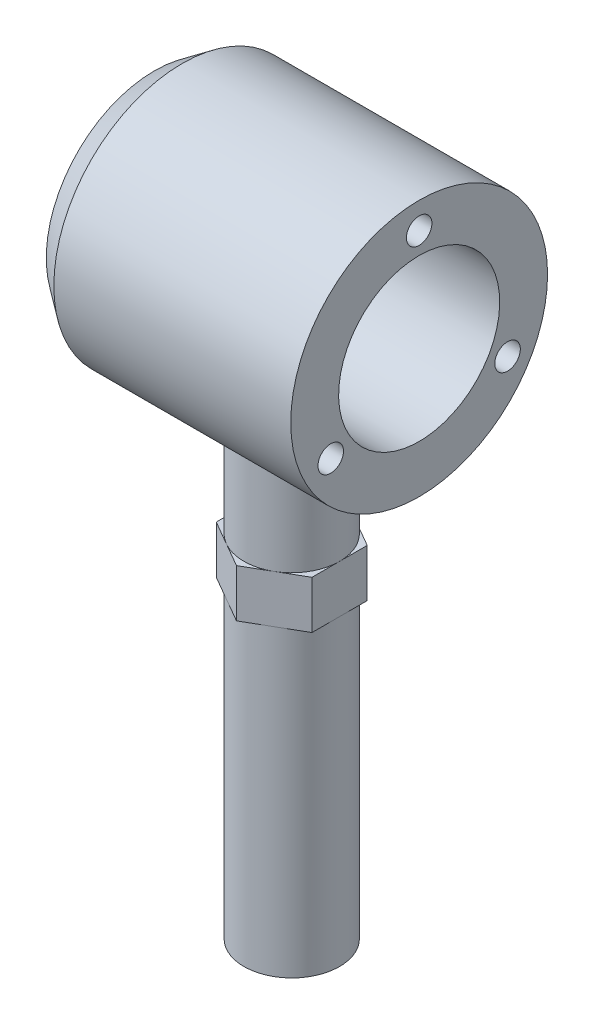
ISO-10303-21;
HEADER;
FILE_DESCRIPTION(('STEP AP214'),'2;1');
FILE_NAME('part.step','',(''),(''),'','','');
FILE_SCHEMA(('AUTOMOTIVE_DESIGN { 1 0 10303 214 1 1 1 1 }'));
ENDSEC;
DATA;
#1=APPLICATION_CONTEXT('core data for automotive mechanical design processes');
#2=APPLICATION_PROTOCOL_DEFINITION('international standard','automotive_design',2000,#1);
#3=PRODUCT_CONTEXT('',#1,'mechanical');
#4=PRODUCT('Part','Part','',(#3));
#5=PRODUCT_RELATED_PRODUCT_CATEGORY('part','',(#4));
#6=PRODUCT_DEFINITION_FORMATION('','',#4);
#7=PRODUCT_DEFINITION_CONTEXT('part definition',#1,'design');
#8=PRODUCT_DEFINITION('design','',#6,#7);
#9=PRODUCT_DEFINITION_SHAPE('','',#8);
#10=(LENGTH_UNIT() NAMED_UNIT(*) SI_UNIT(.MILLI.,.METRE.));
#11=(NAMED_UNIT(*) PLANE_ANGLE_UNIT() SI_UNIT($,.RADIAN.));
#12=(NAMED_UNIT(*) SI_UNIT($,.STERADIAN.) SOLID_ANGLE_UNIT());
#13=UNCERTAINTY_MEASURE_WITH_UNIT(LENGTH_MEASURE(1.E-05),#10,'distance_accuracy_value','');
#14=(GEOMETRIC_REPRESENTATION_CONTEXT(3) GLOBAL_UNCERTAINTY_ASSIGNED_CONTEXT((#13)) GLOBAL_UNIT_ASSIGNED_CONTEXT((#10,
#11,#12)) REPRESENTATION_CONTEXT('',''));
#15=CARTESIAN_POINT('',(0.,0.,0.));
#16=DIRECTION('',(0.,0.,1.));
#17=DIRECTION('',(1.,0.,0.));
#18=AXIS2_PLACEMENT_3D('',#15,#16,#17);
#19=CARTESIAN_POINT('',(0.,-85.2499999999994,0.));
#20=DIRECTION('',(0.,-1.,0.));
#21=DIRECTION('',(0.,0.,-1.));
#22=AXIS2_PLACEMENT_3D('',#19,#20,#21);
#23=PLANE('',#22);
#24=CARTESIAN_POINT('',(41.8971242584859,-85.2499999999994,0.));
#25=DIRECTION('',(0.,-1.,0.));
#26=DIRECTION('',(0.,0.,-1.));
#27=AXIS2_PLACEMENT_3D('',#24,#25,#26);
#28=CIRCLE('',#27,15.);
#29=CARTESIAN_POINT('',(49.3971242584859,-85.2499999999994,-12.9903810567666));
#30=VERTEX_POINT('',#29);
#31=CARTESIAN_POINT('',(56.8971242584859,-85.2499999999994,0.));
#32=VERTEX_POINT('',#31);
#33=EDGE_CURVE('E46',#30,#32,#28,.T.);
#34=ORIENTED_EDGE('',*,*,#33,.F.);
#35=DIRECTION('',(0.866025403784438,0.,0.5));
#36=VECTOR('',#35,1.);
#37=CARTESIAN_POINT('',(41.8971242584859,-85.2499999999994,-17.3205080756888));
#38=LINE('',#37,#36);
#39=CARTESIAN_POINT('',(56.8971242584859,-85.2499999999994,-8.66025403784439));
#40=VERTEX_POINT('',#39);
#41=EDGE_CURVE('E134',#30,#40,#38,.T.);
#42=ORIENTED_EDGE('',*,*,#41,.T.);
#43=DIRECTION('',(0.,0.,1.));
#44=VECTOR('',#43,1.);
#45=CARTESIAN_POINT('',(56.8971242584859,-85.2499999999994,-8.66025403784439));
#46=LINE('',#45,#44);
#47=EDGE_CURVE('E147',#40,#32,#46,.T.);
#48=ORIENTED_EDGE('',*,*,#47,.T.);
#49=EDGE_LOOP('',(#34,#42,#48));
#50=FACE_BOUND('',#49,.T.);
#51=ADVANCED_FACE('F35',(#50),#23,.T.);
#52=CARTESIAN_POINT('',(49.3971242584859,-85.2499999999994,12.9903810567666));
#53=VERTEX_POINT('',#52);
#54=EDGE_CURVE('E11',#32,#53,#28,.T.);
#55=ORIENTED_EDGE('',*,*,#54,.F.);
#56=CARTESIAN_POINT('',(56.8971242584859,-85.2499999999994,8.66025403784441));
#57=VERTEX_POINT('',#56);
#58=EDGE_CURVE('E133',#32,#57,#46,.T.);
#59=ORIENTED_EDGE('',*,*,#58,.T.);
#60=DIRECTION('',(-0.866025403784439,0.,0.5));
#61=VECTOR('',#60,1.);
#62=CARTESIAN_POINT('',(56.8971242584859,-85.2499999999994,8.66025403784441));
#63=LINE('',#62,#61);
#64=EDGE_CURVE('E161',#57,#53,#63,.T.);
#65=ORIENTED_EDGE('',*,*,#64,.T.);
#66=EDGE_LOOP('',(#55,#59,#65));
#67=FACE_BOUND('',#66,.T.);
#68=ADVANCED_FACE('F291',(#67),#23,.T.);
#69=CARTESIAN_POINT('',(34.3971242584859,-85.2499999999994,12.9903810567666));
#70=VERTEX_POINT('',#69);
#71=EDGE_CURVE('E44',#53,#70,#28,.T.);
#72=ORIENTED_EDGE('',*,*,#71,.F.);
#73=CARTESIAN_POINT('',(41.8971242584859,-85.2499999999994,17.3205080756888));
#74=VERTEX_POINT('',#73);
#75=EDGE_CURVE('E160',#53,#74,#63,.T.);
#76=ORIENTED_EDGE('',*,*,#75,.T.);
#77=DIRECTION('',(-0.866025403784438,0.,-0.5));
#78=VECTOR('',#77,1.);
#79=CARTESIAN_POINT('',(41.8971242584859,-85.2499999999994,17.3205080756888));
#80=LINE('',#79,#78);
#81=EDGE_CURVE('E165',#74,#70,#80,.T.);
#82=ORIENTED_EDGE('',*,*,#81,.T.);
#83=EDGE_LOOP('',(#72,#76,#82));
#84=FACE_BOUND('',#83,.T.);
#85=ADVANCED_FACE('F295',(#84),#23,.T.);
#86=CARTESIAN_POINT('',(26.8971242584859,-85.2499999999994,0.));
#87=VERTEX_POINT('',#86);
#88=EDGE_CURVE('E153',#70,#87,#28,.T.);
#89=ORIENTED_EDGE('',*,*,#88,.F.);
#90=CARTESIAN_POINT('',(26.8971242584859,-85.2499999999994,8.6602540378444));
#91=VERTEX_POINT('',#90);
#92=EDGE_CURVE('E164',#70,#91,#80,.T.);
#93=ORIENTED_EDGE('',*,*,#92,.T.);
#94=DIRECTION('',(0.,0.,-1.));
#95=VECTOR('',#94,1.);
#96=CARTESIAN_POINT('',(26.8971242584859,-85.2499999999994,8.6602540378444));
#97=LINE('',#96,#95);
#98=EDGE_CURVE('E169',#91,#87,#97,.T.);
#99=ORIENTED_EDGE('',*,*,#98,.T.);
#100=EDGE_LOOP('',(#89,#93,#99));
#101=FACE_BOUND('',#100,.T.);
#102=ADVANCED_FACE('F300',(#101),#23,.T.);
#103=CARTESIAN_POINT('',(34.3971242584859,-85.2499999999994,-12.9903810567666));
#104=VERTEX_POINT('',#103);
#105=EDGE_CURVE('E61',#87,#104,#28,.T.);
#106=ORIENTED_EDGE('',*,*,#105,.F.);
#107=CARTESIAN_POINT('',(26.8971242584859,-85.2499999999994,-8.66025403784439));
#108=VERTEX_POINT('',#107);
#109=EDGE_CURVE('E168',#87,#108,#97,.T.);
#110=ORIENTED_EDGE('',*,*,#109,.T.);
#111=DIRECTION('',(0.866025403784439,0.,-0.5));
#112=VECTOR('',#111,1.);
#113=CARTESIAN_POINT('',(26.8971242584859,-85.2499999999994,-8.66025403784439));
#114=LINE('',#113,#112);
#115=EDGE_CURVE('E172',#108,#104,#114,.T.);
#116=ORIENTED_EDGE('',*,*,#115,.T.);
#117=EDGE_LOOP('',(#106,#110,#116));
#118=FACE_BOUND('',#117,.T.);
#119=ADVANCED_FACE('F256',(#118),#23,.T.);
#120=CARTESIAN_POINT('',(28.8350884325895,2.56739074444567E-13,0.));
#121=DIRECTION('',(1.,0.,0.));
#122=DIRECTION('',(0.,1.,0.));
#123=AXIS2_PLACEMENT_3D('',#120,#121,#122);
#124=CYLINDRICAL_SURFACE('',#123,40.2499999999997);
#125=CARTESIAN_POINT('',(81.8350884325897,4.70445966746391E-13,0.));
#126=DIRECTION('',(1.,0.,0.));
#127=DIRECTION('',(0.,1.,0.));
#128=AXIS2_PLACEMENT_3D('',#125,#126,#127);
#129=CIRCLE('',#128,40.2499999999995);
#130=CARTESIAN_POINT('',(81.8350884325895,40.25,0.));
#131=VERTEX_POINT('',#130);
#132=EDGE_CURVE('E395',#131,#131,#129,.T.);
#133=ORIENTED_EDGE('',*,*,#132,.F.);
#134=EDGE_LOOP('',(#133));
#135=FACE_BOUND('',#134,.T.);
#136=CARTESIAN_POINT('',(7.57330234901002,1.71007183336871E-13,0.));
#137=DIRECTION('',(1.,0.,0.));
#138=DIRECTION('',(0.,1.,0.));
#139=AXIS2_PLACEMENT_3D('',#136,#137,#138);
#140=CIRCLE('',#139,40.2499999999998);
#141=CARTESIAN_POINT('',(7.57330234900986,40.25,0.));
#142=VERTEX_POINT('',#141);
#143=EDGE_CURVE('E392',#142,#142,#140,.T.);
#144=ORIENTED_EDGE('',*,*,#143,.T.);
#145=EDGE_LOOP('',(#144));
#146=FACE_BOUND('',#145,.T.);
#147=CARTESIAN_POINT('',(41.8971242584859,-37.3505354713952,-15.));
#148=CARTESIAN_POINT('',(41.4918986978602,-37.3505338025353,-15.0000018497057));
#149=CARTESIAN_POINT('',(41.0866982597162,-37.3571477327432,-14.9835659963186));
#150=CARTESIAN_POINT('',(40.2793995634444,-37.3833761869725,-14.9180072768781));
#151=CARTESIAN_POINT('',(39.8773010620853,-37.4029896809622,-14.8688870006024));
#152=CARTESIAN_POINT('',(39.0791892176302,-37.4545677515676,-14.7384785565835));
#153=CARTESIAN_POINT('',(38.6831756511136,-37.4865318735733,-14.6571915728509));
#154=CARTESIAN_POINT('',(37.9000054329187,-37.5617825214386,-14.4632566805358));
#155=CARTESIAN_POINT('',(37.5128490314259,-37.6050693666994,-14.3506078872666));
#156=CARTESIAN_POINT('',(36.75090780851,-37.7015058503863,-14.0953009450391));
#157=CARTESIAN_POINT('',(36.3760951469648,-37.7546312058185,-13.9527165684369));
#158=CARTESIAN_POINT('',(35.6401650063317,-37.8692473637011,-13.6385681081603));
#159=CARTESIAN_POINT('',(35.2790474217659,-37.9307381017055,-13.4670042477382));
#160=CARTESIAN_POINT('',(34.5725545360774,-38.0603626486624,-13.0961771681135));
#161=CARTESIAN_POINT('',(34.2271802917306,-38.1284969026018,-12.8969120930849));
#162=CARTESIAN_POINT('',(33.553957865317,-38.2696032267491,-12.4719723252303));
#163=CARTESIAN_POINT('',(33.226116085081,-38.3425770425873,-12.2462880803025));
#164=CARTESIAN_POINT('',(32.5756569642096,-38.4947770447326,-11.7593599683097));
#165=CARTESIAN_POINT('',(32.2539199789196,-38.5741369644634,-11.496981212973));
#166=CARTESIAN_POINT('',(31.6334232315975,-38.733914872845,-10.9466174539189));
#167=CARTESIAN_POINT('',(31.3346641867453,-38.8143328944293,-10.6586316515671));
#168=CARTESIAN_POINT('',(30.7617758903872,-38.974129560428,-10.0586343101454));
#169=CARTESIAN_POINT('',(30.4876559816715,-39.0535078009082,-9.74661374003535));
#170=CARTESIAN_POINT('',(29.9659751475847,-39.2090913128773,-9.10054997178441));
#171=CARTESIAN_POINT('',(29.7184050312948,-39.2852976767697,-8.76651445977742));
#172=CARTESIAN_POINT('',(29.2434769097455,-39.4350705412568,-8.06660072628778));
#173=CARTESIAN_POINT('',(29.017085594269,-39.5084606085146,-7.70002766482184));
#174=CARTESIAN_POINT('',(28.5961421686724,-39.6476879064449,-6.94763946263695));
#175=CARTESIAN_POINT('',(28.4015909783137,-39.7135249189169,-6.56182376647844));
#176=CARTESIAN_POINT('',(28.0460795265715,-39.8357386173575,-5.7736807254816));
#177=CARTESIAN_POINT('',(27.8851103697655,-39.8921178077969,-5.3713577870622));
#178=CARTESIAN_POINT('',(27.5982494534346,-39.9937784357444,-4.55303546250069));
#179=CARTESIAN_POINT('',(27.4723557781209,-40.0390604793517,-4.13703682470012));
#180=CARTESIAN_POINT('',(27.2615422056069,-40.1155024238907,-3.31255173926044));
#181=CARTESIAN_POINT('',(27.1751039413366,-40.1471822104725,-2.9045014585279));
#182=CARTESIAN_POINT('',(27.0364442876051,-40.1982355576367,-2.08186431923066));
#183=CARTESIAN_POINT('',(26.9842220101725,-40.2176094375809,-1.6672776305844));
#184=CARTESIAN_POINT('',(26.9145573389342,-40.2434934432216,-0.834906065271848));
#185=CARTESIAN_POINT('',(26.8971053965612,-40.250007100565,-0.417122098282105));
#186=CARTESIAN_POINT('',(26.8971431492582,-40.2499928886853,0.418438033509508));
#187=CARTESIAN_POINT('',(26.9146318028312,-40.2434654081876,0.836214198172751));
#188=CARTESIAN_POINT('',(26.9826471134102,-40.2181949424941,1.64806112527682));
#189=CARTESIAN_POINT('',(27.0315148721919,-40.2000654666236,2.04229133982967));
#190=CARTESIAN_POINT('',(27.1602036447057,-40.1526555974769,2.82496842263227));
#191=CARTESIAN_POINT('',(27.2400234611382,-40.123375635529,3.21341551398361));
#192=CARTESIAN_POINT('',(27.4298835629872,-40.0544097382854,3.98191162361454));
#193=CARTESIAN_POINT('',(27.5399249307856,-40.0147234302898,4.36196034058038));
#194=CARTESIAN_POINT('',(27.789270596936,-39.9259373230551,5.1111995503836));
#195=CARTESIAN_POINT('',(27.9285756513744,-39.8768372805961,5.48038976238858));
#196=CARTESIAN_POINT('',(28.2375372439613,-39.7696558863483,6.21089564805672));
#197=CARTESIAN_POINT('',(28.4076032171408,-39.711455023129,6.57202048671505));
#198=CARTESIAN_POINT('',(28.7753834756469,-39.5880358697858,7.27863813029077));
#199=CARTESIAN_POINT('',(28.9730978552793,-39.5228175557263,7.6241308818835));
#200=CARTESIAN_POINT('',(29.3948121202575,-39.3869327395012,8.29759353426153));
#201=CARTESIAN_POINT('',(29.6188145981394,-39.3162657002176,8.62556170212029));
#202=CARTESIAN_POINT('',(30.0917353315306,-39.1711507284454,9.26229625753831));
#203=CARTESIAN_POINT('',(30.3406624931331,-39.0967014492006,9.57105571708524));
#204=CARTESIAN_POINT('',(30.8769579461978,-38.941455430761,10.1848645665764));
#205=CARTESIAN_POINT('',(31.1657157019442,-38.8605403437778,10.4886712801395));
#206=CARTESIAN_POINT('',(31.7676272725638,-38.698645959678,11.0710740789718));
#207=CARTESIAN_POINT('',(32.0807822630617,-38.6176666596535,11.3496689479629));
#208=CARTESIAN_POINT('',(32.7297765397675,-38.457818906184,11.8800431653279));
#209=CARTESIAN_POINT('',(33.0656254432914,-38.3789513676898,12.1318110268962));
#210=CARTESIAN_POINT('',(33.757801015647,-38.2256098627158,12.6066448404323));
#211=CARTESIAN_POINT('',(34.1141200359749,-38.1511342760251,12.8297214130699));
#212=CARTESIAN_POINT('',(34.8532732216621,-38.0071586193817,13.2502411581944));
#213=CARTESIAN_POINT('',(35.2365178500808,-37.9378037439507,13.4470137715939));
#214=CARTESIAN_POINT('',(36.0198133101411,-37.8081490961145,13.8073552057818));
#215=CARTESIAN_POINT('',(36.419864504562,-37.7478495193016,13.9709233093873));
#216=CARTESIAN_POINT('',(37.2337797682004,-37.6383684145397,14.2632429720924));
#217=CARTESIAN_POINT('',(37.6476375365518,-37.5891818925083,14.3920101754512));
#218=CARTESIAN_POINT('',(38.4861890892711,-37.5036410905253,14.6134709695742));
#219=CARTESIAN_POINT('',(38.9108821386525,-37.4672859426554,14.7061670002478));
#220=CARTESIAN_POINT('',(39.7442470881732,-37.4103476018235,14.8503892086882));
#221=CARTESIAN_POINT('',(40.1525269559964,-37.3890113650391,14.9038876437396));
#222=CARTESIAN_POINT('',(40.9725788391234,-37.3597299145293,14.9771377257474));
#223=CARTESIAN_POINT('',(41.3843507263846,-37.351784211926,14.9968906047278));
#224=CARTESIAN_POINT('',(42.2080680812188,-37.34955938528,15.0024304671421));
#225=CARTESIAN_POINT('',(42.6200134920092,-37.355277306608,14.988224793791));
#226=CARTESIAN_POINT('',(43.440927091048,-37.3801754112833,14.9260210947125));
#227=CARTESIAN_POINT('',(43.8498953355314,-37.3993553396805,14.8780237089494));
#228=CARTESIAN_POINT('',(44.6427215458122,-37.4493207529888,14.7517873145815));
#229=CARTESIAN_POINT('',(45.0268596650392,-37.4795218342894,14.6750668085038));
#230=CARTESIAN_POINT('',(45.7870087133847,-37.5506391878258,14.492122583019));
#231=CARTESIAN_POINT('',(46.1630199510394,-37.5915550524997,14.3858999857836));
#232=CARTESIAN_POINT('',(46.9045540504429,-37.6829065234098,14.1448804882563));
#233=CARTESIAN_POINT('',(47.2700772034817,-37.7333418649623,14.0100843824221));
#234=CARTESIAN_POINT('',(47.9886428290767,-37.8423427637767,13.7129366091743));
#235=CARTESIAN_POINT('',(48.3416803853009,-37.9009114798865,13.5505742300646));
#236=CARTESIAN_POINT('',(49.0459112299488,-38.0268753920683,13.1930460644358));
#237=CARTESIAN_POINT('',(49.396559867863,-38.0945158726682,12.9968939773828));
#238=CARTESIAN_POINT('',(50.0804037736037,-38.235016771198,12.5775551147731));
#239=CARTESIAN_POINT('',(50.4135911858408,-38.3078795042404,12.3543563182887));
#240=CARTESIAN_POINT('',(51.0605972166882,-38.4568928484102,11.8823869787047));
#241=CARTESIAN_POINT('',(51.3744139848243,-38.5330437724805,11.6336139985397));
#242=CARTESIAN_POINT('',(51.9809829693244,-38.6866980568484,11.1119673705862));
#243=CARTESIAN_POINT('',(52.2737345108587,-38.7642014603743,10.8390929513253));
#244=CARTESIAN_POINT('',(52.8542538129216,-38.9234948887645,10.2529001693913));
#245=CARTESIAN_POINT('',(53.1405560937935,-39.0052487220269,9.9381184063924));
#246=CARTESIAN_POINT('',(53.6856196623258,-39.1658435842604,9.28505322761171));
#247=CARTESIAN_POINT('',(53.9443906045934,-39.2446856279548,8.94677811964128));
#248=CARTESIAN_POINT('',(54.4327669910697,-39.3973477814355,8.24858698956029));
#249=CARTESIAN_POINT('',(54.6623656909361,-39.4711667281047,7.88866599136185));
#250=CARTESIAN_POINT('',(55.0905654340989,-39.6117214509882,7.1495119984893));
#251=CARTESIAN_POINT('',(55.289167188203,-39.6784573896155,6.77027944692354));
#252=CARTESIAN_POINT('',(55.6530400156863,-39.8027458006346,5.99640930320699));
#253=CARTESIAN_POINT('',(55.8184298780634,-39.8603308430007,5.60183286518926));
#254=CARTESIAN_POINT('',(56.1152600731741,-39.9649669280226,4.79873614652663));
#255=CARTESIAN_POINT('',(56.2467002410304,-40.0120179195195,4.39021579817383));
#256=CARTESIAN_POINT('',(56.4742703832498,-40.0941943995225,3.5624408764151));
#257=CARTESIAN_POINT('',(56.5704138553359,-40.1293244462981,3.1431904720092));
#258=CARTESIAN_POINT('',(56.7264268420457,-40.1866325321612,2.29712704075021));
#259=CARTESIAN_POINT('',(56.7862984108576,-40.2088113047163,1.87031444357642));
#260=CARTESIAN_POINT('',(56.8667152250908,-40.2386612903034,1.03739259425824));
#261=CARTESIAN_POINT('',(56.889329590487,-40.2470954996666,0.631509144149414));
#262=CARTESIAN_POINT('',(56.9015333053774,-40.2516428394924,-0.180814341246079));
#263=CARTESIAN_POINT('',(56.891124003315,-40.2477564730365,-0.58725435312948));
#264=CARTESIAN_POINT('',(56.8373918152945,-40.2277699862298,-1.39759856729221));
#265=CARTESIAN_POINT('',(56.7940726126325,-40.211671232697,-1.80150304824942));
#266=CARTESIAN_POINT('',(56.6749623240815,-40.16769769402,-2.60384040518387));
#267=CARTESIAN_POINT('',(56.5991712531874,-40.1398229143137,-3.00227328368768));
#268=CARTESIAN_POINT('',(56.4180516238533,-40.0738431626237,-3.78137341712809));
#269=CARTESIAN_POINT('',(56.3134731204218,-40.0359988992718,-4.16223764988196));
#270=CARTESIAN_POINT('',(56.0750046082801,-39.9507496545521,-4.91355739997317));
#271=CARTESIAN_POINT('',(55.9411152660094,-39.9033448905632,-5.28401315375168));
#272=CARTESIAN_POINT('',(55.6450986398895,-39.800126428007,-6.01229862638492));
#273=CARTESIAN_POINT('',(55.4829675970486,-39.7443116101888,-6.37012665684595));
#274=CARTESIAN_POINT('',(55.131698605743,-39.6256121950062,-7.0710487069113));
#275=CARTESIAN_POINT('',(54.9425596661832,-39.562727338214,-7.41414218520796));
#276=CARTESIAN_POINT('',(54.5301786307919,-39.4286315224739,-8.09764128801526));
#277=CARTESIAN_POINT('',(54.3058457601821,-39.3571831248437,-8.4373423739723));
#278=CARTESIAN_POINT('',(53.8307288878352,-39.2099782179972,-9.09694285737617));
#279=CARTESIAN_POINT('',(53.5799331180986,-39.1342197990824,-9.41683334388945));
#280=CARTESIAN_POINT('',(53.0535159223831,-38.9803056143601,-10.0349254313672));
#281=CARTESIAN_POINT('',(52.7778919813914,-38.9021496062148,-10.3331248295526));
#282=CARTESIAN_POINT('',(52.2034493045299,-38.7454060540123,-10.9061571733876));
#283=CARTESIAN_POINT('',(51.9046300548409,-38.6668185004316,-11.1809896011329));
#284=CARTESIAN_POINT('',(51.2693299654231,-38.5071601276657,-11.7193865240625));
#285=CARTESIAN_POINT('',(50.9316984175178,-38.4261729504333,-11.9816200423272));
#286=CARTESIAN_POINT('',(50.2346345327049,-38.2682813312039,-12.4767258225162));
#287=CARTESIAN_POINT('',(49.8752015851319,-38.1913770036823,-12.7095972614342));
#288=CARTESIAN_POINT('',(49.1366835506423,-38.0439590577161,-13.1442909517398));
#289=CARTESIAN_POINT('',(48.7575954997609,-37.9734464075604,-13.3461085019267));
#290=CARTESIAN_POINT('',(47.9822818703237,-37.8410595028718,-13.7169787868273));
#291=CARTESIAN_POINT('',(47.5860572675429,-37.7791847573327,-13.8860333841045));
#292=CARTESIAN_POINT('',(46.7635367077273,-37.6639400774036,-14.195721513151));
#293=CARTESIAN_POINT('',(46.3366704095878,-37.610991918919,-14.3350020503276));
#294=CARTESIAN_POINT('',(45.4707663758238,-37.518637297825,-14.5750102944281));
#295=CARTESIAN_POINT('',(45.0317281534286,-37.4792313776335,-14.6757364571219));
#296=CARTESIAN_POINT('',(44.1455336770895,-37.4155403507306,-14.8373651713468));
#297=CARTESIAN_POINT('',(43.6983819446359,-37.3912470731974,-14.8982892432257));
#298=CARTESIAN_POINT('',(42.799850859074,-37.3587464456451,-14.9796034031384));
#299=CARTESIAN_POINT('',(42.3484719754101,-37.3505373302022,-14.9999979397636));
#300=CARTESIAN_POINT('',(41.8971242584859,-37.3505354713952,-15.));
#301=B_SPLINE_CURVE_WITH_KNOTS('',3,(#147,#148,#149,#150,#151,#152,#153,#154,#155,#156,#157,
#158,#159,#160,#161,#162,#163,#164,#165,#166,#167,#168,#169,#170,#171,#172,#173,#174,#175,#176,
#177,#178,#179,#180,#181,#182,#183,#184,#185,#186,#187,#188,#189,#190,#191,#192,#193,#194,#195,
#196,#197,#198,#199,#200,#201,#202,#203,#204,#205,#206,#207,#208,#209,#210,#211,#212,#213,#214,
#215,#216,#217,#218,#219,#220,#221,#222,#223,#224,#225,#226,#227,#228,#229,#230,#231,#232,#233,
#234,#235,#236,#237,#238,#239,#240,#241,#242,#243,#244,#245,#246,#247,#248,#249,#250,#251,#252,
#253,#254,#255,#256,#257,#258,#259,#260,#261,#262,#263,#264,#265,#266,#267,#268,#269,#270,#271,
#272,#273,#274,#275,#276,#277,#278,#279,#280,#281,#282,#283,#284,#285,#286,#287,#288,#289,#290,
#291,#292,#293,#294,#295,#296,#297,#298,#299,#300),.UNSPECIFIED.,.T.,.F.,(4,2,2,2,2,2,2,2,2,2,2,
2,2,2,2,2,2,2,2,2,2,2,2,2,2,2,2,2,2,2,2,2,2,2,2,2,2,2,2,2,2,2,2,2,2,2,2,2,2,2,2,2,2,2,2,2,2,2,2,
2,2,2,2,2,2,2,2,2,2,2,2,2,2,2,2,2,4),(0.,1.21524853972364,2.43040079967717,3.64550833576715,
4.8606501523489,6.07283183985052,7.28500418936705,8.49725778680666,9.7099510477261,
10.9765618739905,12.2432122172615,13.5103408468227,14.7770294003271,16.0865555568648,
17.3961195348385,18.7053361855101,20.0144813140103,21.2677983797557,22.5210829182024,
23.7740232344227,25.0269262039995,26.2185073844804,27.4100424763456,28.6016202484869,
29.7932288112323,31.002053552841,32.2108824177184,33.4198305978164,34.6292123116569,
35.9083955011032,37.1876403684614,38.4674308010831,39.7467461211101,41.0541578347522,
42.3615977841245,43.6684490107897,44.9752118246599,46.2105948714622,47.4459328144237,
48.6810036514286,49.9160510986796,51.0933669991619,52.2706381241811,53.4478765206458,
54.6255734195062,55.8465538312542,57.0680789127461,58.2897205062962,59.5114012180325,
60.8097429773016,62.1076279267687,63.4058123908923,64.7039670812638,65.997392550888,
67.2908243019337,68.5837609184294,69.8766243051422,71.0949165560942,72.3131590616021,
73.5312652407577,74.7493708574203,75.9383337605994,77.1272696331774,78.3163638751104,
79.5055017638513,80.744068940001,81.9831892445765,83.2224352094447,84.4617086337423,
85.7654832666064,87.0692944355769,88.3733027927353,89.6772369956722,91.0316305613031,
92.3860783691959,93.7397932416073,95.0933595197386),.UNSPECIFIED.);
#302=CARTESIAN_POINT('',(41.8971242584859,-37.3505354713952,-15.));
#303=VERTEX_POINT('',#302);
#304=EDGE_CURVE('E211',#303,#303,#301,.T.);
#305=ORIENTED_EDGE('',*,*,#304,.T.);
#306=EDGE_LOOP('',(#305));
#307=FACE_BOUND('',#306,.T.);
#308=ADVANCED_FACE('F354',(#135,#146,#307),#124,.T.);
#309=CARTESIAN_POINT('',(28.8350884325895,2.56739074444567E-13,0.));
#310=DIRECTION('',(1.,0.,0.));
#311=DIRECTION('',(0.,1.,0.));
#312=AXIS2_PLACEMENT_3D('',#309,#310,#311);
#313=SPHERICAL_SURFACE('',#312,25.2499999999999);
#314=CARTESIAN_POINT('',(28.8350884325896,2.56739074444568E-13,0.));
#315=DIRECTION('',(1.,0.,0.));
#316=DIRECTION('',(0.,1.,0.));
#317=AXIS2_PLACEMENT_3D('',#314,#315,#316);
#318=CIRCLE('',#317,25.2499999999998);
#319=CARTESIAN_POINT('',(28.8350884325895,25.2500000000001,0.));
#320=VERTEX_POINT('',#319);
#321=EDGE_CURVE('E39',#320,#320,#318,.T.);
#322=ORIENTED_EDGE('',*,*,#321,.T.);
#323=EDGE_LOOP('',(#322));
#324=FACE_BOUND('',#323,.T.);
#325=CARTESIAN_POINT('',(8.52345383563981,1.74838389401467E-13,0.));
#326=DIRECTION('',(1.,0.,0.));
#327=DIRECTION('',(0.,1.,0.));
#328=AXIS2_PLACEMENT_3D('',#325,#326,#327);
#329=CIRCLE('',#328,14.9999999999998);
#330=CARTESIAN_POINT('',(8.52345383563975,15.,0.));
#331=VERTEX_POINT('',#330);
#332=EDGE_CURVE('E332',#331,#331,#329,.T.);
#333=ORIENTED_EDGE('',*,*,#332,.F.);
#334=EDGE_LOOP('',(#333));
#335=FACE_BOUND('',#334,.T.);
#336=ADVANCED_FACE('F37',(#324,#335),#313,.F.);
#337=CARTESIAN_POINT('',(28.8350884325895,2.56739074444567E-13,0.));
#338=DIRECTION('',(1.,0.,0.));
#339=DIRECTION('',(0.,1.,0.));
#340=AXIS2_PLACEMENT_3D('',#337,#338,#339);
#341=CYLINDRICAL_SURFACE('',#340,25.2499999999997);
#342=CARTESIAN_POINT('',(81.8350884325896,4.70445966746391E-13,0.));
#343=DIRECTION('',(1.,0.,0.));
#344=DIRECTION('',(0.,1.,0.));
#345=AXIS2_PLACEMENT_3D('',#342,#343,#344);
#346=CIRCLE('',#345,25.2499999999995);
#347=CARTESIAN_POINT('',(81.8350884325895,25.25,0.));
#348=VERTEX_POINT('',#347);
#349=EDGE_CURVE('E155',#348,#348,#346,.T.);
#350=ORIENTED_EDGE('',*,*,#349,.T.);
#351=EDGE_LOOP('',(#350));
#352=FACE_BOUND('',#351,.T.);
#353=ORIENTED_EDGE('',*,*,#321,.F.);
#354=EDGE_LOOP('',(#353));
#355=FACE_BOUND('',#354,.T.);
#356=ADVANCED_FACE('F362',(#352,#355),#341,.F.);
#357=CARTESIAN_POINT('',(81.8350884325895,40.25,0.));
#358=DIRECTION('',(1.,0.,0.));
#359=DIRECTION('',(0.,1.,0.));
#360=AXIS2_PLACEMENT_3D('',#357,#358,#359);
#361=PLANE('',#360);
#362=CARTESIAN_POINT('',(81.8350884325897,-16.0000000000009,27.7128129211));
#363=DIRECTION('',(1.,0.,0.));
#364=DIRECTION('',(0.,1.,0.));
#365=AXIS2_PLACEMENT_3D('',#362,#363,#364);
#366=CIRCLE('',#365,4.00000000000259);
#367=CARTESIAN_POINT('',(81.8350884325897,-11.9999999999983,27.7128129211));
#368=VERTEX_POINT('',#367);
#369=EDGE_CURVE('E615',#368,#368,#366,.T.);
#370=ORIENTED_EDGE('',*,*,#369,.F.);
#371=EDGE_LOOP('',(#370));
#372=FACE_BOUND('',#371,.T.);
#373=CARTESIAN_POINT('',(81.8350884325897,-15.9999999999985,-27.7128129211041));
#374=DIRECTION('',(1.,0.,0.));
#375=DIRECTION('',(0.,1.,0.));
#376=AXIS2_PLACEMENT_3D('',#373,#374,#375);
#377=CIRCLE('',#376,4.00000000000176);
#378=CARTESIAN_POINT('',(81.8350884325897,-11.9999999999967,-27.7128129211041));
#379=VERTEX_POINT('',#378);
#380=EDGE_CURVE('E619',#379,#379,#377,.T.);
#381=ORIENTED_EDGE('',*,*,#380,.F.);
#382=EDGE_LOOP('',(#381));
#383=FACE_BOUND('',#382,.T.);
#384=CARTESIAN_POINT('',(81.8350884325895,32.0000000000003,0.));
#385=DIRECTION('',(1.,0.,0.));
#386=DIRECTION('',(0.,1.,0.));
#387=AXIS2_PLACEMENT_3D('',#384,#385,#386);
#388=CIRCLE('',#387,4.);
#389=CARTESIAN_POINT('',(81.8350884325895,36.0000000000003,0.));
#390=VERTEX_POINT('',#389);
#391=EDGE_CURVE('E622',#390,#390,#388,.T.);
#392=ORIENTED_EDGE('',*,*,#391,.F.);
#393=EDGE_LOOP('',(#392));
#394=FACE_BOUND('',#393,.T.);
#395=ORIENTED_EDGE('',*,*,#132,.T.);
#396=EDGE_LOOP('',(#395));
#397=FACE_BOUND('',#396,.T.);
#398=ORIENTED_EDGE('',*,*,#349,.F.);
#399=EDGE_LOOP('',(#398));
#400=FACE_BOUND('',#399,.T.);
#401=ADVANCED_FACE('F370',(#372,#383,#394,#397,#400),#361,.T.);
#402=CARTESIAN_POINT('',(7.57330234901002,1.71007183336871E-13,0.));
#403=DIRECTION('',(1.,0.,0.));
#404=DIRECTION('',(0.,1.,0.));
#405=AXIS2_PLACEMENT_3D('',#402,#403,#404);
#406=CONICAL_SURFACE('',#405,40.2499999999998,0.629881060132371);
#407=CARTESIAN_POINT('',(-1.16491156741034,1.35772908990706E-13,0.));
#408=DIRECTION('',(1.,0.,0.));
#409=DIRECTION('',(0.,1.,0.));
#410=AXIS2_PLACEMENT_3D('',#407,#408,#409);
#411=CIRCLE('',#410,33.8804312224532);
#412=CARTESIAN_POINT('',(-1.16491156741047,33.8804312224533,0.));
#413=VERTEX_POINT('',#412);
#414=EDGE_CURVE('E387',#413,#413,#411,.T.);
#415=ORIENTED_EDGE('',*,*,#414,.T.);
#416=EDGE_LOOP('',(#415));
#417=FACE_BOUND('',#416,.T.);
#418=ORIENTED_EDGE('',*,*,#143,.F.);
#419=EDGE_LOOP('',(#418));
#420=FACE_BOUND('',#419,.T.);
#421=ADVANCED_FACE('F368',(#417,#420),#406,.T.);
#422=CARTESIAN_POINT('',(-1.16491156741044,20.8950275718443,0.));
#423=DIRECTION('',(-1.,0.,0.));
#424=DIRECTION('',(0.,-1.,0.));
#425=AXIS2_PLACEMENT_3D('',#422,#423,#424);
#426=PLANE('',#425);
#427=CARTESIAN_POINT('',(-1.16491156741039,1.35772908990706E-13,0.));
#428=DIRECTION('',(1.,0.,0.));
#429=DIRECTION('',(0.,1.,0.));
#430=AXIS2_PLACEMENT_3D('',#427,#428,#429);
#431=CIRCLE('',#430,20.8950275718442);
#432=CARTESIAN_POINT('',(-1.16491156741047,20.8950275718443,0.));
#433=VERTEX_POINT('',#432);
#434=EDGE_CURVE('E385',#433,#433,#431,.T.);
#435=ORIENTED_EDGE('',*,*,#434,.T.);
#436=EDGE_LOOP('',(#435));
#437=FACE_BOUND('',#436,.T.);
#438=ORIENTED_EDGE('',*,*,#414,.F.);
#439=EDGE_LOOP('',(#438));
#440=FACE_BOUND('',#439,.T.);
#441=ADVANCED_FACE('F402',(#437,#440),#426,.T.);
#442=CARTESIAN_POINT('',(-1.16491156741039,1.35772908990706E-13,0.));
#443=DIRECTION('',(-1.,0.,0.));
#444=DIRECTION('',(0.,-1.,0.));
#445=AXIS2_PLACEMENT_3D('',#442,#443,#444);
#446=CONICAL_SURFACE('',#445,20.8950275718442,0.546620249654706);
#447=ORIENTED_EDGE('',*,*,#332,.T.);
#448=EDGE_LOOP('',(#447));
#449=FACE_BOUND('',#448,.T.);
#450=ORIENTED_EDGE('',*,*,#434,.F.);
#451=EDGE_LOOP('',(#450));
#452=FACE_BOUND('',#451,.T.);
#453=ADVANCED_FACE('F351',(#449,#452),#446,.F.);
#454=CARTESIAN_POINT('',(41.8971242584859,-70.2499999999994,0.));
#455=DIRECTION('',(0.,1.,0.));
#456=DIRECTION('',(0.,0.,1.));
#457=AXIS2_PLACEMENT_3D('',#454,#455,#456);
#458=CYLINDRICAL_SURFACE('',#457,15.);
#459=CARTESIAN_POINT('',(41.8971242584859,-70.2499999999994,0.));
#460=DIRECTION('',(0.,-1.,0.));
#461=DIRECTION('',(0.,0.,-1.));
#462=AXIS2_PLACEMENT_3D('',#459,#460,#461);
#463=CIRCLE('',#462,15.);
#464=CARTESIAN_POINT('',(49.3971242584859,-70.2499999999994,-12.9903810567666));
#465=VERTEX_POINT('',#464);
#466=CARTESIAN_POINT('',(56.8971242584859,-70.2499999999994,0.));
#467=VERTEX_POINT('',#466);
#468=EDGE_CURVE('E219',#465,#467,#463,.T.);
#469=ORIENTED_EDGE('',*,*,#468,.F.);
#470=CARTESIAN_POINT('',(34.3971242584859,-70.2499999999994,-12.9903810567666));
#471=VERTEX_POINT('',#470);
#472=EDGE_CURVE('E218',#471,#465,#463,.T.);
#473=ORIENTED_EDGE('',*,*,#472,.F.);
#474=CARTESIAN_POINT('',(26.8971242584859,-70.2499999999994,0.));
#475=VERTEX_POINT('',#474);
#476=EDGE_CURVE('E327',#475,#471,#463,.T.);
#477=ORIENTED_EDGE('',*,*,#476,.F.);
#478=CARTESIAN_POINT('',(34.3971242584859,-70.2499999999994,12.9903810567666));
#479=VERTEX_POINT('',#478);
#480=EDGE_CURVE('E342',#479,#475,#463,.T.);
#481=ORIENTED_EDGE('',*,*,#480,.F.);
#482=CARTESIAN_POINT('',(49.3971242584859,-70.2499999999994,12.9903810567666));
#483=VERTEX_POINT('',#482);
#484=EDGE_CURVE('E341',#483,#479,#463,.T.);
#485=ORIENTED_EDGE('',*,*,#484,.F.);
#486=EDGE_CURVE('E333',#467,#483,#463,.T.);
#487=ORIENTED_EDGE('',*,*,#486,.F.);
#488=EDGE_LOOP('',(#469,#473,#477,#481,#485,#487));
#489=FACE_BOUND('',#488,.T.);
#490=ORIENTED_EDGE('',*,*,#304,.F.);
#491=EDGE_LOOP('',(#490));
#492=FACE_BOUND('',#491,.T.);
#493=ADVANCED_FACE('F252',(#489,#492),#458,.T.);
#494=CARTESIAN_POINT('',(0.,-70.2499999999994,0.));
#495=DIRECTION('',(0.,-1.,0.));
#496=DIRECTION('',(0.,0.,-1.));
#497=AXIS2_PLACEMENT_3D('',#494,#495,#496);
#498=PLANE('',#497);
#499=DIRECTION('',(0.866025403784438,0.,0.5));
#500=VECTOR('',#499,1.);
#501=CARTESIAN_POINT('',(41.8971242584859,-70.2499999999994,-17.3205080756888));
#502=LINE('',#501,#500);
#503=CARTESIAN_POINT('',(56.8971242584859,-70.2499999999994,-8.66025403784439));
#504=VERTEX_POINT('',#503);
#505=EDGE_CURVE('E178',#465,#504,#502,.T.);
#506=ORIENTED_EDGE('',*,*,#505,.F.);
#507=ORIENTED_EDGE('',*,*,#468,.T.);
#508=DIRECTION('',(0.,0.,1.));
#509=VECTOR('',#508,1.);
#510=CARTESIAN_POINT('',(56.8971242584859,-70.2499999999994,-8.66025403784439));
#511=LINE('',#510,#509);
#512=EDGE_CURVE('E179',#504,#467,#511,.T.);
#513=ORIENTED_EDGE('',*,*,#512,.F.);
#514=EDGE_LOOP('',(#506,#507,#513));
#515=FACE_BOUND('',#514,.T.);
#516=ADVANCED_FACE('F248',(#515),#498,.F.);
#517=CARTESIAN_POINT('',(56.8971242584859,-70.2499999999994,8.66025403784441));
#518=VERTEX_POINT('',#517);
#519=EDGE_CURVE('E177',#467,#518,#511,.T.);
#520=ORIENTED_EDGE('',*,*,#519,.F.);
#521=ORIENTED_EDGE('',*,*,#486,.T.);
#522=DIRECTION('',(-0.866025403784439,0.,0.5));
#523=VECTOR('',#522,1.);
#524=CARTESIAN_POINT('',(56.8971242584859,-70.2499999999994,8.66025403784441));
#525=LINE('',#524,#523);
#526=EDGE_CURVE('E183',#518,#483,#525,.T.);
#527=ORIENTED_EDGE('',*,*,#526,.F.);
#528=EDGE_LOOP('',(#520,#521,#527));
#529=FACE_BOUND('',#528,.T.);
#530=ADVANCED_FACE('F251',(#529),#498,.F.);
#531=CARTESIAN_POINT('',(41.8971242584859,-70.2499999999994,17.3205080756888));
#532=VERTEX_POINT('',#531);
#533=EDGE_CURVE('E182',#483,#532,#525,.T.);
#534=ORIENTED_EDGE('',*,*,#533,.F.);
#535=ORIENTED_EDGE('',*,*,#484,.T.);
#536=DIRECTION('',(-0.866025403784438,0.,-0.5));
#537=VECTOR('',#536,1.);
#538=CARTESIAN_POINT('',(41.8971242584859,-70.2499999999994,17.3205080756888));
#539=LINE('',#538,#537);
#540=EDGE_CURVE('E187',#532,#479,#539,.T.);
#541=ORIENTED_EDGE('',*,*,#540,.F.);
#542=EDGE_LOOP('',(#534,#535,#541));
#543=FACE_BOUND('',#542,.T.);
#544=ADVANCED_FACE('F340',(#543),#498,.F.);
#545=CARTESIAN_POINT('',(26.8971242584859,-70.2499999999994,8.6602540378444));
#546=VERTEX_POINT('',#545);
#547=EDGE_CURVE('E186',#479,#546,#539,.T.);
#548=ORIENTED_EDGE('',*,*,#547,.F.);
#549=ORIENTED_EDGE('',*,*,#480,.T.);
#550=DIRECTION('',(0.,0.,-1.));
#551=VECTOR('',#550,1.);
#552=CARTESIAN_POINT('',(26.8971242584859,-70.2499999999994,8.6602540378444));
#553=LINE('',#552,#551);
#554=EDGE_CURVE('E191',#546,#475,#553,.T.);
#555=ORIENTED_EDGE('',*,*,#554,.F.);
#556=EDGE_LOOP('',(#548,#549,#555));
#557=FACE_BOUND('',#556,.T.);
#558=ADVANCED_FACE('F345',(#557),#498,.F.);
#559=CARTESIAN_POINT('',(26.8971242584859,-70.2499999999994,-8.66025403784439));
#560=VERTEX_POINT('',#559);
#561=EDGE_CURVE('E190',#475,#560,#553,.T.);
#562=ORIENTED_EDGE('',*,*,#561,.F.);
#563=ORIENTED_EDGE('',*,*,#476,.T.);
#564=DIRECTION('',(0.866025403784439,0.,-0.5));
#565=VECTOR('',#564,1.);
#566=CARTESIAN_POINT('',(26.8971242584859,-70.2499999999994,-8.66025403784439));
#567=LINE('',#566,#565);
#568=EDGE_CURVE('E145',#560,#471,#567,.T.);
#569=ORIENTED_EDGE('',*,*,#568,.F.);
#570=EDGE_LOOP('',(#562,#563,#569));
#571=FACE_BOUND('',#570,.T.);
#572=ADVANCED_FACE('F348',(#571),#498,.F.);
#573=CARTESIAN_POINT('',(41.8971242584859,-70.2499999999994,-17.3205080756888));
#574=VERTEX_POINT('',#573);
#575=EDGE_CURVE('E194',#471,#574,#567,.T.);
#576=ORIENTED_EDGE('',*,*,#575,.F.);
#577=ORIENTED_EDGE('',*,*,#472,.T.);
#578=EDGE_CURVE('E175',#574,#465,#502,.T.);
#579=ORIENTED_EDGE('',*,*,#578,.F.);
#580=EDGE_LOOP('',(#576,#577,#579));
#581=FACE_BOUND('',#580,.T.);
#582=ADVANCED_FACE('F228',(#581),#498,.F.);
#583=CARTESIAN_POINT('',(41.8971242584859,-85.2499999999994,-17.3205080756888));
#584=DIRECTION('',(-0.5,0.,0.866025403784438));
#585=DIRECTION('',(0.866025403784439,0.,0.5));
#586=AXIS2_PLACEMENT_3D('',#583,#584,#585);
#587=PLANE('',#586);
#588=ORIENTED_EDGE('',*,*,#578,.T.);
#589=ORIENTED_EDGE('',*,*,#505,.T.);
#590=DIRECTION('',(0.,1.,0.));
#591=VECTOR('',#590,1.);
#592=CARTESIAN_POINT('',(56.8971242584859,-85.2499999999994,-8.66025403784439));
#593=LINE('',#592,#591);
#594=EDGE_CURVE('E141',#40,#504,#593,.T.);
#595=ORIENTED_EDGE('',*,*,#594,.F.);
#596=ORIENTED_EDGE('',*,*,#41,.F.);
#597=CARTESIAN_POINT('',(41.8971242584859,-85.2499999999994,-17.3205080756888));
#598=VERTEX_POINT('',#597);
#599=EDGE_CURVE('E126',#598,#30,#38,.T.);
#600=ORIENTED_EDGE('',*,*,#599,.F.);
#601=DIRECTION('',(0.,1.,0.));
#602=VECTOR('',#601,1.);
#603=CARTESIAN_POINT('',(41.8971242584859,-85.2499999999994,-17.3205080756888));
#604=LINE('',#603,#602);
#605=EDGE_CURVE('E174',#598,#574,#604,.T.);
#606=ORIENTED_EDGE('',*,*,#605,.T.);
#607=EDGE_LOOP('',(#588,#589,#595,#596,#600,#606));
#608=FACE_BOUND('',#607,.T.);
#609=ADVANCED_FACE('F139',(#608),#587,.F.);
#610=CARTESIAN_POINT('',(56.8971242584859,-85.2499999999994,-8.66025403784439));
#611=DIRECTION('',(-1.,0.,0.));
#612=DIRECTION('',(0.,0.,1.));
#613=AXIS2_PLACEMENT_3D('',#610,#611,#612);
#614=PLANE('',#613);
#615=ORIENTED_EDGE('',*,*,#512,.T.);
#616=ORIENTED_EDGE('',*,*,#519,.T.);
#617=DIRECTION('',(0.,1.,0.));
#618=VECTOR('',#617,1.);
#619=CARTESIAN_POINT('',(56.8971242584859,-85.2499999999994,8.66025403784441));
#620=LINE('',#619,#618);
#621=EDGE_CURVE('E207',#57,#518,#620,.T.);
#622=ORIENTED_EDGE('',*,*,#621,.F.);
#623=ORIENTED_EDGE('',*,*,#58,.F.);
#624=ORIENTED_EDGE('',*,*,#47,.F.);
#625=ORIENTED_EDGE('',*,*,#594,.T.);
#626=EDGE_LOOP('',(#615,#616,#622,#623,#624,#625));
#627=FACE_BOUND('',#626,.T.);
#628=ADVANCED_FACE('F227',(#627),#614,.F.);
#629=CARTESIAN_POINT('',(56.8971242584859,-85.2499999999994,8.66025403784441));
#630=DIRECTION('',(-0.5,0.,-0.866025403784439));
#631=DIRECTION('',(-0.866025403784439,0.,0.5));
#632=AXIS2_PLACEMENT_3D('',#629,#630,#631);
#633=PLANE('',#632);
#634=ORIENTED_EDGE('',*,*,#526,.T.);
#635=ORIENTED_EDGE('',*,*,#533,.T.);
#636=DIRECTION('',(0.,1.,0.));
#637=VECTOR('',#636,1.);
#638=CARTESIAN_POINT('',(41.8971242584859,-85.2499999999994,17.3205080756888));
#639=LINE('',#638,#637);
#640=EDGE_CURVE('E204',#74,#532,#639,.T.);
#641=ORIENTED_EDGE('',*,*,#640,.F.);
#642=ORIENTED_EDGE('',*,*,#75,.F.);
#643=ORIENTED_EDGE('',*,*,#64,.F.);
#644=ORIENTED_EDGE('',*,*,#621,.T.);
#645=EDGE_LOOP('',(#634,#635,#641,#642,#643,#644));
#646=FACE_BOUND('',#645,.T.);
#647=ADVANCED_FACE('F231',(#646),#633,.F.);
#648=CARTESIAN_POINT('',(41.8971242584859,-85.2499999999994,17.3205080756888));
#649=DIRECTION('',(0.5,0.,-0.866025403784438));
#650=DIRECTION('',(-0.866025403784438,0.,-0.5));
#651=AXIS2_PLACEMENT_3D('',#648,#649,#650);
#652=PLANE('',#651);
#653=ORIENTED_EDGE('',*,*,#540,.T.);
#654=ORIENTED_EDGE('',*,*,#547,.T.);
#655=DIRECTION('',(0.,1.,0.));
#656=VECTOR('',#655,1.);
#657=CARTESIAN_POINT('',(26.8971242584859,-85.2499999999994,8.6602540378444));
#658=LINE('',#657,#656);
#659=EDGE_CURVE('E201',#91,#546,#658,.T.);
#660=ORIENTED_EDGE('',*,*,#659,.F.);
#661=ORIENTED_EDGE('',*,*,#92,.F.);
#662=ORIENTED_EDGE('',*,*,#81,.F.);
#663=ORIENTED_EDGE('',*,*,#640,.T.);
#664=EDGE_LOOP('',(#653,#654,#660,#661,#662,#663));
#665=FACE_BOUND('',#664,.T.);
#666=ADVANCED_FACE('F235',(#665),#652,.F.);
#667=CARTESIAN_POINT('',(26.8971242584859,-85.2499999999994,8.6602540378444));
#668=DIRECTION('',(1.,0.,0.));
#669=DIRECTION('',(0.,0.,-1.));
#670=AXIS2_PLACEMENT_3D('',#667,#668,#669);
#671=PLANE('',#670);
#672=ORIENTED_EDGE('',*,*,#554,.T.);
#673=ORIENTED_EDGE('',*,*,#561,.T.);
#674=DIRECTION('',(0.,1.,0.));
#675=VECTOR('',#674,1.);
#676=CARTESIAN_POINT('',(26.8971242584859,-85.2499999999994,-8.66025403784439));
#677=LINE('',#676,#675);
#678=EDGE_CURVE('E198',#108,#560,#677,.T.);
#679=ORIENTED_EDGE('',*,*,#678,.F.);
#680=ORIENTED_EDGE('',*,*,#109,.F.);
#681=ORIENTED_EDGE('',*,*,#98,.F.);
#682=ORIENTED_EDGE('',*,*,#659,.T.);
#683=EDGE_LOOP('',(#672,#673,#679,#680,#681,#682));
#684=FACE_BOUND('',#683,.T.);
#685=ADVANCED_FACE('F239',(#684),#671,.F.);
#686=CARTESIAN_POINT('',(26.8971242584859,-85.2499999999994,-8.66025403784439));
#687=DIRECTION('',(0.5,0.,0.866025403784438));
#688=DIRECTION('',(0.866025403784439,0.,-0.5));
#689=AXIS2_PLACEMENT_3D('',#686,#687,#688);
#690=PLANE('',#689);
#691=ORIENTED_EDGE('',*,*,#568,.T.);
#692=ORIENTED_EDGE('',*,*,#575,.T.);
#693=ORIENTED_EDGE('',*,*,#605,.F.);
#694=EDGE_CURVE('E129',#104,#598,#114,.T.);
#695=ORIENTED_EDGE('',*,*,#694,.F.);
#696=ORIENTED_EDGE('',*,*,#115,.F.);
#697=ORIENTED_EDGE('',*,*,#678,.T.);
#698=EDGE_LOOP('',(#691,#692,#693,#695,#696,#697));
#699=FACE_BOUND('',#698,.T.);
#700=ADVANCED_FACE('F243',(#699),#690,.F.);
#701=EDGE_CURVE('E53',#104,#30,#28,.T.);
#702=ORIENTED_EDGE('',*,*,#701,.F.);
#703=ORIENTED_EDGE('',*,*,#694,.T.);
#704=ORIENTED_EDGE('',*,*,#599,.T.);
#705=EDGE_LOOP('',(#702,#703,#704));
#706=FACE_BOUND('',#705,.T.);
#707=ADVANCED_FACE('F128',(#706),#23,.T.);
#708=CARTESIAN_POINT('',(41.8971242584859,-180.249999999999,0.));
#709=DIRECTION('',(0.,1.,0.));
#710=DIRECTION('',(0.,0.,1.));
#711=AXIS2_PLACEMENT_3D('',#708,#709,#710);
#712=CYLINDRICAL_SURFACE('',#711,15.);
#713=CARTESIAN_POINT('',(41.8971242584859,-180.249999999999,0.));
#714=DIRECTION('',(0.,-1.,0.));
#715=DIRECTION('',(0.,0.,-1.));
#716=AXIS2_PLACEMENT_3D('',#713,#714,#715);
#717=CIRCLE('',#716,15.);
#718=CARTESIAN_POINT('',(41.8971242584859,-180.249999999999,-15.));
#719=VERTEX_POINT('',#718);
#720=EDGE_CURVE('E149',#719,#719,#717,.T.);
#721=ORIENTED_EDGE('',*,*,#720,.F.);
#722=EDGE_LOOP('',(#721));
#723=FACE_BOUND('',#722,.T.);
#724=ORIENTED_EDGE('',*,*,#33,.T.);
#725=ORIENTED_EDGE('',*,*,#54,.T.);
#726=ORIENTED_EDGE('',*,*,#71,.T.);
#727=ORIENTED_EDGE('',*,*,#88,.T.);
#728=ORIENTED_EDGE('',*,*,#105,.T.);
#729=ORIENTED_EDGE('',*,*,#701,.T.);
#730=EDGE_LOOP('',(#724,#725,#726,#727,#728,#729));
#731=FACE_BOUND('',#730,.T.);
#732=ADVANCED_FACE('F151',(#723,#731),#712,.T.);
#733=CARTESIAN_POINT('',(41.8971242584859,-180.249999999999,0.));
#734=DIRECTION('',(0.,-1.,0.));
#735=DIRECTION('',(0.,0.,-1.));
#736=AXIS2_PLACEMENT_3D('',#733,#734,#735);
#737=PLANE('',#736);
#738=ORIENTED_EDGE('',*,*,#720,.T.);
#739=EDGE_LOOP('',(#738));
#740=FACE_BOUND('',#739,.T.);
#741=ADVANCED_FACE('F259',(#740),#737,.T.);
#742=CARTESIAN_POINT('',(61.8350884325895,32.0000000000002,0.));
#743=DIRECTION('',(1.,0.,0.));
#744=DIRECTION('',(0.,1.,0.));
#745=AXIS2_PLACEMENT_3D('',#742,#743,#744);
#746=CYLINDRICAL_SURFACE('',#745,4.);
#747=CARTESIAN_POINT('',(61.8350884325895,32.0000000000002,0.));
#748=DIRECTION('',(1.,0.,0.));
#749=DIRECTION('',(0.,1.,0.));
#750=AXIS2_PLACEMENT_3D('',#747,#748,#749);
#751=CIRCLE('',#750,4.);
#752=CARTESIAN_POINT('',(61.8350884325895,36.0000000000003,0.));
#753=VERTEX_POINT('',#752);
#754=EDGE_CURVE('E150',#753,#753,#751,.T.);
#755=ORIENTED_EDGE('',*,*,#754,.F.);
#756=EDGE_LOOP('',(#755));
#757=FACE_BOUND('',#756,.T.);
#758=ORIENTED_EDGE('',*,*,#391,.T.);
#759=EDGE_LOOP('',(#758));
#760=FACE_BOUND('',#759,.T.);
#761=ADVANCED_FACE('F263',(#757,#760),#746,.F.);
#762=CARTESIAN_POINT('',(61.8350884325895,32.0000000000002,0.));
#763=DIRECTION('',(1.,0.,0.));
#764=DIRECTION('',(0.,1.,0.));
#765=AXIS2_PLACEMENT_3D('',#762,#763,#764);
#766=PLANE('',#765);
#767=ORIENTED_EDGE('',*,*,#754,.T.);
#768=EDGE_LOOP('',(#767));
#769=FACE_BOUND('',#768,.T.);
#770=ADVANCED_FACE('F267',(#769),#766,.T.);
#771=CARTESIAN_POINT('',(61.8350884325897,-15.9999999999986,-27.7128129211041));
#772=DIRECTION('',(1.,0.,0.));
#773=DIRECTION('',(0.,1.,0.));
#774=AXIS2_PLACEMENT_3D('',#771,#772,#773);
#775=CYLINDRICAL_SURFACE('',#774,4.00000000000176);
#776=CARTESIAN_POINT('',(61.8350884325897,-15.9999999999986,-27.7128129211041));
#777=DIRECTION('',(1.,0.,0.));
#778=DIRECTION('',(0.,1.,0.));
#779=AXIS2_PLACEMENT_3D('',#776,#777,#778);
#780=CIRCLE('',#779,4.00000000000176);
#781=CARTESIAN_POINT('',(61.8350884325897,-11.9999999999968,-27.7128129211041));
#782=VERTEX_POINT('',#781);
#783=EDGE_CURVE('E624',#782,#782,#780,.T.);
#784=ORIENTED_EDGE('',*,*,#783,.F.);
#785=EDGE_LOOP('',(#784));
#786=FACE_BOUND('',#785,.T.);
#787=ORIENTED_EDGE('',*,*,#380,.T.);
#788=EDGE_LOOP('',(#787));
#789=FACE_BOUND('',#788,.T.);
#790=ADVANCED_FACE('F271',(#786,#789),#775,.F.);
#791=CARTESIAN_POINT('',(61.8350884325897,-15.9999999999986,-27.7128129211041));
#792=DIRECTION('',(1.,0.,0.));
#793=DIRECTION('',(0.,1.,0.));
#794=AXIS2_PLACEMENT_3D('',#791,#792,#793);
#795=PLANE('',#794);
#796=ORIENTED_EDGE('',*,*,#783,.T.);
#797=EDGE_LOOP('',(#796));
#798=FACE_BOUND('',#797,.T.);
#799=ADVANCED_FACE('F275',(#798),#795,.T.);
#800=CARTESIAN_POINT('',(61.8350884325897,-16.0000000000009,27.7128129211));
#801=DIRECTION('',(1.,0.,0.));
#802=DIRECTION('',(0.,1.,0.));
#803=AXIS2_PLACEMENT_3D('',#800,#801,#802);
#804=CYLINDRICAL_SURFACE('',#803,4.00000000000259);
#805=CARTESIAN_POINT('',(61.8350884325897,-16.0000000000009,27.7128129211));
#806=DIRECTION('',(1.,0.,0.));
#807=DIRECTION('',(0.,1.,0.));
#808=AXIS2_PLACEMENT_3D('',#805,#806,#807);
#809=CIRCLE('',#808,4.00000000000259);
#810=CARTESIAN_POINT('',(61.8350884325897,-11.9999999999983,27.7128129211));
#811=VERTEX_POINT('',#810);
#812=EDGE_CURVE('E630',#811,#811,#809,.T.);
#813=ORIENTED_EDGE('',*,*,#812,.F.);
#814=EDGE_LOOP('',(#813));
#815=FACE_BOUND('',#814,.T.);
#816=ORIENTED_EDGE('',*,*,#369,.T.);
#817=EDGE_LOOP('',(#816));
#818=FACE_BOUND('',#817,.T.);
#819=ADVANCED_FACE('F279',(#815,#818),#804,.F.);
#820=CARTESIAN_POINT('',(61.8350884325897,-16.0000000000009,27.7128129211));
#821=DIRECTION('',(1.,0.,0.));
#822=DIRECTION('',(0.,1.,0.));
#823=AXIS2_PLACEMENT_3D('',#820,#821,#822);
#824=PLANE('',#823);
#825=ORIENTED_EDGE('',*,*,#812,.T.);
#826=EDGE_LOOP('',(#825));
#827=FACE_BOUND('',#826,.T.);
#828=ADVANCED_FACE('F283',(#827),#824,.T.);
#829=CLOSED_SHELL('',(#51,#68,#85,#102,#119,#308,#336,#356,#401,#421,#441,#453,#493,#516,#530,
#544,#558,#572,#582,#609,#628,#647,#666,#685,#700,#707,#732,#741,#761,#770,#790,#799,#819,#828));
#830=MANIFOLD_SOLID_BREP('B2',#829);
#831=ADVANCED_BREP_SHAPE_REPRESENTATION('',(#18,#830),#14);
#832=SHAPE_DEFINITION_REPRESENTATION(#9,#831);
ENDSEC;
END-ISO-10303-21;
